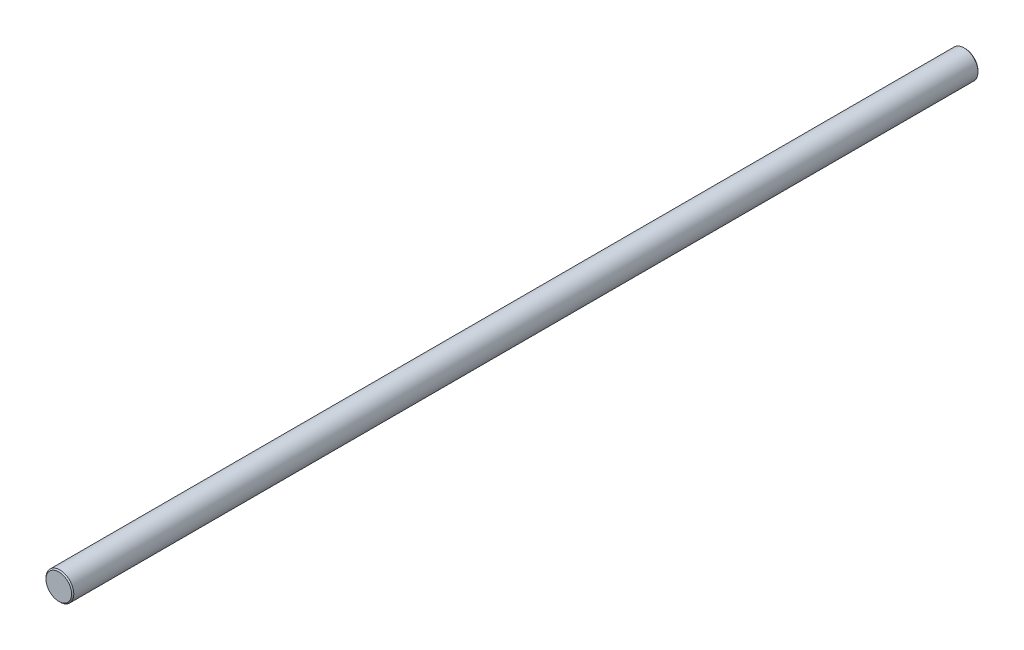
ISO-10303-21;
HEADER;
FILE_DESCRIPTION(('STEP AP214'),'2;1');
FILE_NAME('part.step','',(''),(''),'','','');
FILE_SCHEMA(('AUTOMOTIVE_DESIGN { 1 0 10303 214 1 1 1 1 }'));
ENDSEC;
DATA;
#1=APPLICATION_CONTEXT('core data for automotive mechanical design processes');
#2=APPLICATION_PROTOCOL_DEFINITION('international standard','automotive_design',2000,#1);
#3=PRODUCT_CONTEXT('',#1,'mechanical');
#4=PRODUCT('Part','Part','',(#3));
#5=PRODUCT_RELATED_PRODUCT_CATEGORY('part','',(#4));
#6=PRODUCT_DEFINITION_FORMATION('','',#4);
#7=PRODUCT_DEFINITION_CONTEXT('part definition',#1,'design');
#8=PRODUCT_DEFINITION('design','',#6,#7);
#9=PRODUCT_DEFINITION_SHAPE('','',#8);
#10=(LENGTH_UNIT() NAMED_UNIT(*) SI_UNIT(.MILLI.,.METRE.));
#11=(NAMED_UNIT(*) PLANE_ANGLE_UNIT() SI_UNIT($,.RADIAN.));
#12=(NAMED_UNIT(*) SI_UNIT($,.STERADIAN.) SOLID_ANGLE_UNIT());
#13=UNCERTAINTY_MEASURE_WITH_UNIT(LENGTH_MEASURE(1.E-05),#10,'distance_accuracy_value','');
#14=(GEOMETRIC_REPRESENTATION_CONTEXT(3) GLOBAL_UNCERTAINTY_ASSIGNED_CONTEXT((#13)) GLOBAL_UNIT_ASSIGNED_CONTEXT((#10,
#11,#12)) REPRESENTATION_CONTEXT('',''));
#15=CARTESIAN_POINT('',(0.,0.,0.));
#16=DIRECTION('',(0.,0.,1.));
#17=DIRECTION('',(1.,0.,0.));
#18=AXIS2_PLACEMENT_3D('',#15,#16,#17);
#19=CARTESIAN_POINT('',(0.,0.,407.));
#20=DIRECTION('',(0.,0.,-1.));
#21=DIRECTION('',(-1.,0.,0.));
#22=AXIS2_PLACEMENT_3D('',#19,#20,#21);
#23=CYLINDRICAL_SURFACE('',#22,12.5);
#24=CARTESIAN_POINT('',(0.,0.,-406.));
#25=DIRECTION('',(0.,0.,1.));
#26=DIRECTION('',(1.,0.,0.));
#27=AXIS2_PLACEMENT_3D('',#24,#25,#26);
#28=CIRCLE('',#27,12.5);
#29=CARTESIAN_POINT('',(12.5,0.,-406.));
#30=VERTEX_POINT('',#29);
#31=EDGE_CURVE('E43',#30,#30,#28,.T.);
#32=ORIENTED_EDGE('',*,*,#31,.T.);
#33=EDGE_LOOP('',(#32));
#34=FACE_BOUND('',#33,.T.);
#35=CARTESIAN_POINT('',(0.,0.,406.));
#36=DIRECTION('',(0.,0.,1.));
#37=DIRECTION('',(1.,0.,0.));
#38=AXIS2_PLACEMENT_3D('',#35,#36,#37);
#39=CIRCLE('',#38,12.5);
#40=CARTESIAN_POINT('',(12.5,0.,406.));
#41=VERTEX_POINT('',#40);
#42=EDGE_CURVE('E47',#41,#41,#39,.F.);
#43=ORIENTED_EDGE('',*,*,#42,.T.);
#44=EDGE_LOOP('',(#43));
#45=FACE_BOUND('',#44,.T.);
#46=ADVANCED_FACE('F32',(#34,#45),#23,.T.);
#47=CARTESIAN_POINT('',(0.,0.,407.));
#48=DIRECTION('',(0.,0.,1.));
#49=DIRECTION('',(1.,0.,0.));
#50=AXIS2_PLACEMENT_3D('',#47,#48,#49);
#51=PLANE('',#50);
#52=CARTESIAN_POINT('',(0.,0.,407.));
#53=DIRECTION('',(0.,0.,1.));
#54=DIRECTION('',(1.,0.,0.));
#55=AXIS2_PLACEMENT_3D('',#52,#53,#54);
#56=CIRCLE('',#55,11.5000000000001);
#57=CARTESIAN_POINT('',(11.5000000000001,0.,407.));
#58=VERTEX_POINT('',#57);
#59=EDGE_CURVE('E10',#58,#58,#56,.T.);
#60=ORIENTED_EDGE('',*,*,#59,.T.);
#61=EDGE_LOOP('',(#60));
#62=FACE_BOUND('',#61,.T.);
#63=ADVANCED_FACE('F63',(#62),#51,.T.);
#64=CARTESIAN_POINT('',(0.,0.,-407.));
#65=DIRECTION('',(0.,0.,1.));
#66=DIRECTION('',(1.,0.,0.));
#67=AXIS2_PLACEMENT_3D('',#64,#65,#66);
#68=PLANE('',#67);
#69=CARTESIAN_POINT('',(0.,0.,-407.));
#70=DIRECTION('',(0.,0.,1.));
#71=DIRECTION('',(1.,0.,0.));
#72=AXIS2_PLACEMENT_3D('',#69,#70,#71);
#73=CIRCLE('',#72,11.5);
#74=CARTESIAN_POINT('',(11.5,0.,-407.));
#75=VERTEX_POINT('',#74);
#76=EDGE_CURVE('E39',#75,#75,#73,.F.);
#77=ORIENTED_EDGE('',*,*,#76,.T.);
#78=EDGE_LOOP('',(#77));
#79=FACE_BOUND('',#78,.T.);
#80=ADVANCED_FACE('F60',(#79),#68,.F.);
#81=CARTESIAN_POINT('',(0.,0.,-406.));
#82=DIRECTION('',(0.,0.,1.));
#83=DIRECTION('',(1.,0.,0.));
#84=AXIS2_PLACEMENT_3D('',#81,#82,#83);
#85=CONICAL_SURFACE('',#84,12.5,0.785398163397471);
#86=ORIENTED_EDGE('',*,*,#76,.F.);
#87=EDGE_LOOP('',(#86));
#88=FACE_BOUND('',#87,.T.);
#89=ORIENTED_EDGE('',*,*,#31,.F.);
#90=EDGE_LOOP('',(#89));
#91=FACE_BOUND('',#90,.T.);
#92=ADVANCED_FACE('F56',(#88,#91),#85,.T.);
#93=CARTESIAN_POINT('',(0.,0.,407.));
#94=DIRECTION('',(0.,0.,-1.));
#95=DIRECTION('',(-1.,0.,0.));
#96=AXIS2_PLACEMENT_3D('',#93,#94,#95);
#97=CONICAL_SURFACE('',#96,11.5000000000001,0.785398163397415);
#98=ORIENTED_EDGE('',*,*,#42,.F.);
#99=EDGE_LOOP('',(#98));
#100=FACE_BOUND('',#99,.T.);
#101=ORIENTED_EDGE('',*,*,#59,.F.);
#102=EDGE_LOOP('',(#101));
#103=FACE_BOUND('',#102,.T.);
#104=ADVANCED_FACE('F34',(#100,#103),#97,.T.);
#105=CLOSED_SHELL('',(#46,#63,#80,#92,#104));
#106=MANIFOLD_SOLID_BREP('B2',#105);
#107=ADVANCED_BREP_SHAPE_REPRESENTATION('',(#18,#106),#14);
#108=SHAPE_DEFINITION_REPRESENTATION(#9,#107);
ENDSEC;
END-ISO-10303-21;
